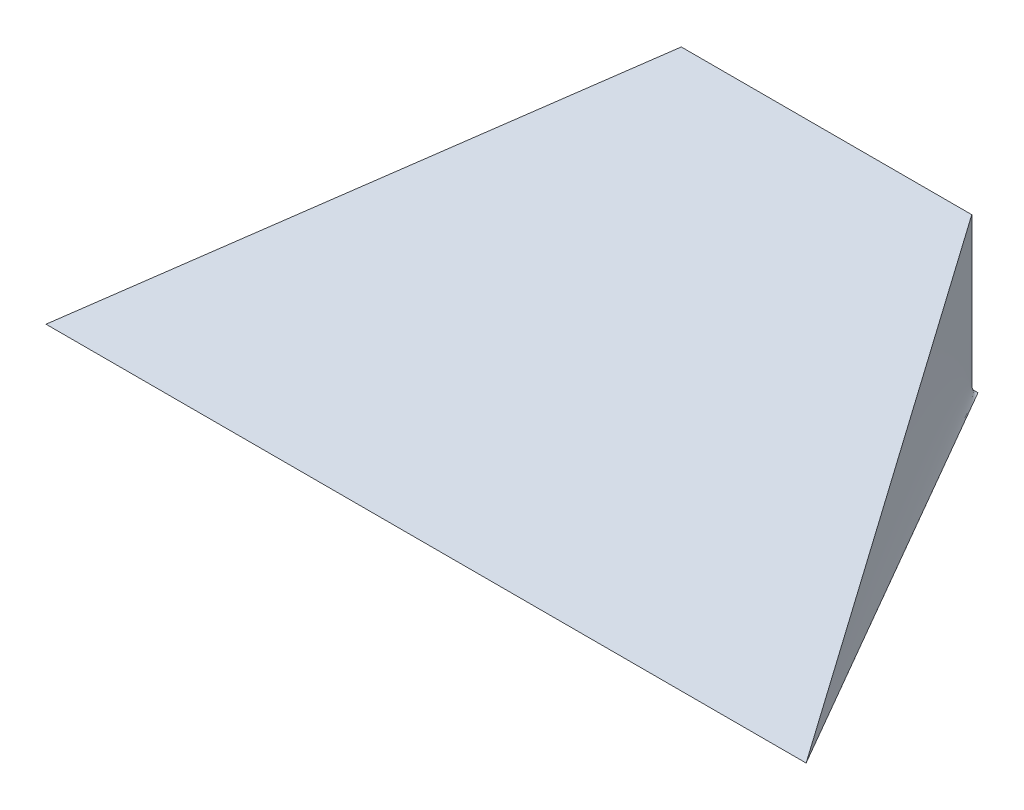
ISO-10303-21;
HEADER;
FILE_DESCRIPTION(('STEP AP214'),'2;1');
FILE_NAME('part.step','',(''),(''),'','','');
FILE_SCHEMA(('AUTOMOTIVE_DESIGN { 1 0 10303 214 1 1 1 1 }'));
ENDSEC;
DATA;
#1=APPLICATION_CONTEXT('core data for automotive mechanical design processes');
#2=APPLICATION_PROTOCOL_DEFINITION('international standard','automotive_design',2000,#1);
#3=PRODUCT_CONTEXT('',#1,'mechanical');
#4=PRODUCT('Part','Part','',(#3));
#5=PRODUCT_RELATED_PRODUCT_CATEGORY('part','',(#4));
#6=PRODUCT_DEFINITION_FORMATION('','',#4);
#7=PRODUCT_DEFINITION_CONTEXT('part definition',#1,'design');
#8=PRODUCT_DEFINITION('design','',#6,#7);
#9=PRODUCT_DEFINITION_SHAPE('','',#8);
#10=(LENGTH_UNIT() NAMED_UNIT(*) SI_UNIT(.MILLI.,.METRE.));
#11=(NAMED_UNIT(*) PLANE_ANGLE_UNIT() SI_UNIT($,.RADIAN.));
#12=(NAMED_UNIT(*) SI_UNIT($,.STERADIAN.) SOLID_ANGLE_UNIT());
#13=UNCERTAINTY_MEASURE_WITH_UNIT(LENGTH_MEASURE(1.E-05),#10,'distance_accuracy_value','');
#14=(GEOMETRIC_REPRESENTATION_CONTEXT(3) GLOBAL_UNCERTAINTY_ASSIGNED_CONTEXT((#13)) GLOBAL_UNIT_ASSIGNED_CONTEXT((#10,
#11,#12)) REPRESENTATION_CONTEXT('',''));
#15=CARTESIAN_POINT('',(0.,0.,0.));
#16=DIRECTION('',(0.,0.,1.));
#17=DIRECTION('',(1.,0.,0.));
#18=AXIS2_PLACEMENT_3D('',#15,#16,#17);
#19=CARTESIAN_POINT('',(-38.5188845990112,0.,7.00000000000005));
#20=DIRECTION('',(0.,-1.,0.));
#21=DIRECTION('',(0.,0.,-1.));
#22=AXIS2_PLACEMENT_3D('',#19,#20,#21);
#23=PLANE('',#22);
#24=DIRECTION('',(1.,0.,0.));
#25=VECTOR('',#24,1.);
#26=CARTESIAN_POINT('',(-25.4359808303565,0.,7.00000000000005));
#27=LINE('',#26,#25);
#28=CARTESIAN_POINT('',(-38.5188845990112,0.,7.00000000000005));
#29=VERTEX_POINT('',#28);
#30=CARTESIAN_POINT('',(-25.4359808303565,0.,7.00000000000005));
#31=VERTEX_POINT('',#30);
#32=EDGE_CURVE('E140',#29,#31,#27,.T.);
#33=ORIENTED_EDGE('',*,*,#32,.F.);
#34=DIRECTION('',(-0.499999999999998,0.,0.86602540378444));
#35=VECTOR('',#34,1.);
#36=CARTESIAN_POINT('',(-38.5188845990112,0.,7.00000000000005));
#37=LINE('',#36,#35);
#38=CARTESIAN_POINT('',(-34.4774327146839,0.,0.));
#39=VERTEX_POINT('',#38);
#40=EDGE_CURVE('E143',#39,#29,#37,.T.);
#41=ORIENTED_EDGE('',*,*,#40,.F.);
#42=DIRECTION('',(-1.,0.,0.));
#43=VECTOR('',#42,1.);
#44=CARTESIAN_POINT('',(-34.4774327146839,0.,0.));
#45=LINE('',#44,#43);
#46=CARTESIAN_POINT('',(-29.5845168864685,0.,0.));
#47=VERTEX_POINT('',#46);
#48=EDGE_CURVE('E88',#47,#39,#45,.T.);
#49=ORIENTED_EDGE('',*,*,#48,.F.);
#50=CARTESIAN_POINT('',(-29.4774327146839,0.,0.));
#51=VERTEX_POINT('',#50);
#52=EDGE_CURVE('E49',#51,#47,#45,.T.);
#53=ORIENTED_EDGE('',*,*,#52,.F.);
#54=DIRECTION('',(-0.499999999999997,0.,-0.86602540378444));
#55=VECTOR('',#54,1.);
#56=CARTESIAN_POINT('',(-29.4774327146839,0.,0.));
#57=LINE('',#56,#55);
#58=EDGE_CURVE('E12',#31,#51,#57,.T.);
#59=ORIENTED_EDGE('',*,*,#58,.F.);
#60=EDGE_LOOP('',(#33,#41,#49,#53,#59));
#61=FACE_BOUND('',#60,.T.);
#62=ADVANCED_FACE('F37',(#61),#23,.T.);
#63=CARTESIAN_POINT('',(-34.4774327146839,0.,0.));
#64=CARTESIAN_POINT('',(-34.5845168864685,0.,0.));
#65=CARTESIAN_POINT('',(-35.1510080287384,0.,1.16666666666667));
#66=CARTESIAN_POINT('',(-34.5845168864685,0.433333333333333,0.));
#67=CARTESIAN_POINT('',(-35.824583342793,0.,2.33333333333334));
#68=CARTESIAN_POINT('',(-34.5845168864685,0.866666666666666,0.));
#69=CARTESIAN_POINT('',(-37.1717339709021,0.,4.66666666666669));
#70=CARTESIAN_POINT('',(-34.5845168864685,1.73333333333333,0.));
#71=CARTESIAN_POINT('',(-37.8453092849567,0.,5.83333333333337));
#72=CARTESIAN_POINT('',(-34.5845168864685,2.16666666666667,0.));
#73=CARTESIAN_POINT('',(-38.5188845990112,0.,7.00000000000005));
#74=CARTESIAN_POINT('',(-34.5845168864685,2.6,0.));
#75=B_SPLINE_SURFACE_WITH_KNOTS('',3,1,((#63,#64),(#65,#66),(#67,#68),(#69,#70),(#71,#72),(#73,
#74)),.UNSPECIFIED.,.F.,.F.,.F.,(4,2,4),(2,2),(0.,0.5,1.),(0.,1.),.UNSPECIFIED.);
#76=DIRECTION('',(0.466138828326893,0.308044657286656,-0.829351000387157));
#77=VECTOR('',#76,1.);
#78=CARTESIAN_POINT('',(-36.5517007427398,1.3,3.50000000000002));
#79=LINE('',#78,#77);
#80=CARTESIAN_POINT('',(-34.5845168864685,2.6,0.));
#81=VERTEX_POINT('',#80);
#82=EDGE_CURVE('E92',#29,#81,#79,.T.);
#83=DIRECTION('',(0.,-1.,0.));
#84=VECTOR('',#83,1.);
#85=CARTESIAN_POINT('',(-34.5845168864685,0.,0.));
#86=LINE('',#85,#84);
#87=CARTESIAN_POINT('',(-34.5845168864685,0.,0.));
#88=VERTEX_POINT('',#87);
#89=EDGE_CURVE('E85',#81,#88,#86,.T.);
#90=DIRECTION('',(1.,0.,0.));
#91=VECTOR('',#90,1.);
#92=CARTESIAN_POINT('',(-34.5845168864685,0.,0.));
#93=LINE('',#92,#91);
#94=EDGE_CURVE('E83',#88,#39,#93,.T.);
#95=ORIENTED_EDGE('',*,*,#40,.T.);
#96=ORIENTED_EDGE('',*,*,#82,.T.);
#97=ORIENTED_EDGE('',*,*,#89,.T.);
#98=ORIENTED_EDGE('',*,*,#94,.T.);
#99=EDGE_LOOP('',(#95,#96,#97,#98));
#100=FACE_BOUND('',#99,.T.);
#101=ADVANCED_FACE('F96',(#100),#75,.T.);
#102=CARTESIAN_POINT('',(-25.4359808303565,0.,7.00000000000005));
#103=CARTESIAN_POINT('',(-29.5845168864685,2.6,0.));
#104=CARTESIAN_POINT('',(-26.1095561444111,0.,5.83333333333337));
#105=CARTESIAN_POINT('',(-29.5845168864685,2.16666666666666,0.));
#106=CARTESIAN_POINT('',(-26.7831314584657,0.,4.6666666666667));
#107=CARTESIAN_POINT('',(-29.5845168864685,1.73333333333333,0.));
#108=CARTESIAN_POINT('',(-28.1302820865748,0.,2.33333333333335));
#109=CARTESIAN_POINT('',(-29.5845168864685,0.866666666666662,0.));
#110=CARTESIAN_POINT('',(-28.8038574006294,0.,1.16666666666668));
#111=CARTESIAN_POINT('',(-29.5845168864685,0.43333333333333,0.));
#112=CARTESIAN_POINT('',(-29.4774327146839,0.,0.));
#113=CARTESIAN_POINT('',(-29.5845168864685,0.,0.));
#114=B_SPLINE_SURFACE_WITH_KNOTS('',3,1,((#102,#103),(#104,#105),(#106,#107),(#108,#109),(#110,
#111),(#112,#113)),.UNSPECIFIED.,.F.,.F.,.F.,(4,2,4),(2,2),(0.,0.5,1.),(0.,1.),.UNSPECIFIED.);
#115=DIRECTION('',(0.,1.,0.));
#116=VECTOR('',#115,1.);
#117=CARTESIAN_POINT('',(-29.5845168864685,0.,0.));
#118=LINE('',#117,#116);
#119=CARTESIAN_POINT('',(-29.5845168864685,2.6,0.));
#120=VERTEX_POINT('',#119);
#121=EDGE_CURVE('E93',#47,#120,#118,.T.);
#122=DIRECTION('',(0.485648050991827,-0.30436879793258,0.819454455972335));
#123=VECTOR('',#122,1.);
#124=CARTESIAN_POINT('',(-27.5102488584125,1.3,3.50000000000002));
#125=LINE('',#124,#123);
#126=EDGE_CURVE('E138',#120,#31,#125,.T.);
#127=ORIENTED_EDGE('',*,*,#58,.T.);
#128=ORIENTED_EDGE('',*,*,#52,.T.);
#129=ORIENTED_EDGE('',*,*,#121,.T.);
#130=ORIENTED_EDGE('',*,*,#126,.T.);
#131=EDGE_LOOP('',(#127,#128,#129,#130));
#132=FACE_BOUND('',#131,.T.);
#133=ADVANCED_FACE('F116',(#132),#114,.T.);
#134=CARTESIAN_POINT('',(-29.5845168864685,2.6,0.));
#135=DIRECTION('',(0.,0.937425272009766,0.348186529603625));
#136=DIRECTION('',(0.,-0.348186529603625,0.937425272009766));
#137=AXIS2_PLACEMENT_3D('',#134,#135,#136);
#138=PLANE('',#137);
#139=ORIENTED_EDGE('',*,*,#126,.F.);
#140=DIRECTION('',(-1.,0.,0.));
#141=VECTOR('',#140,1.);
#142=CARTESIAN_POINT('',(-34.5845168864685,2.6,0.));
#143=LINE('',#142,#141);
#144=EDGE_CURVE('E75',#120,#81,#143,.T.);
#145=ORIENTED_EDGE('',*,*,#144,.T.);
#146=ORIENTED_EDGE('',*,*,#82,.F.);
#147=ORIENTED_EDGE('',*,*,#32,.T.);
#148=EDGE_LOOP('',(#139,#145,#146,#147));
#149=FACE_BOUND('',#148,.T.);
#150=ADVANCED_FACE('F117',(#149),#138,.T.);
#151=CARTESIAN_POINT('',(-34.5845168864685,2.6,0.));
#152=DIRECTION('',(0.,0.,-1.));
#153=DIRECTION('',(-1.,0.,0.));
#154=AXIS2_PLACEMENT_3D('',#151,#152,#153);
#155=PLANE('',#154);
#156=ORIENTED_EDGE('',*,*,#89,.F.);
#157=ORIENTED_EDGE('',*,*,#144,.F.);
#158=ORIENTED_EDGE('',*,*,#121,.F.);
#159=ORIENTED_EDGE('',*,*,#48,.T.);
#160=ORIENTED_EDGE('',*,*,#94,.F.);
#161=EDGE_LOOP('',(#156,#157,#158,#159,#160));
#162=FACE_BOUND('',#161,.T.);
#163=ADVANCED_FACE('F39',(#162),#155,.T.);
#164=CLOSED_SHELL('',(#62,#101,#133,#150,#163));
#165=MANIFOLD_SOLID_BREP('B2',#164);
#166=ADVANCED_BREP_SHAPE_REPRESENTATION('',(#18,#165),#14);
#167=SHAPE_DEFINITION_REPRESENTATION(#9,#166);
ENDSEC;
END-ISO-10303-21;
